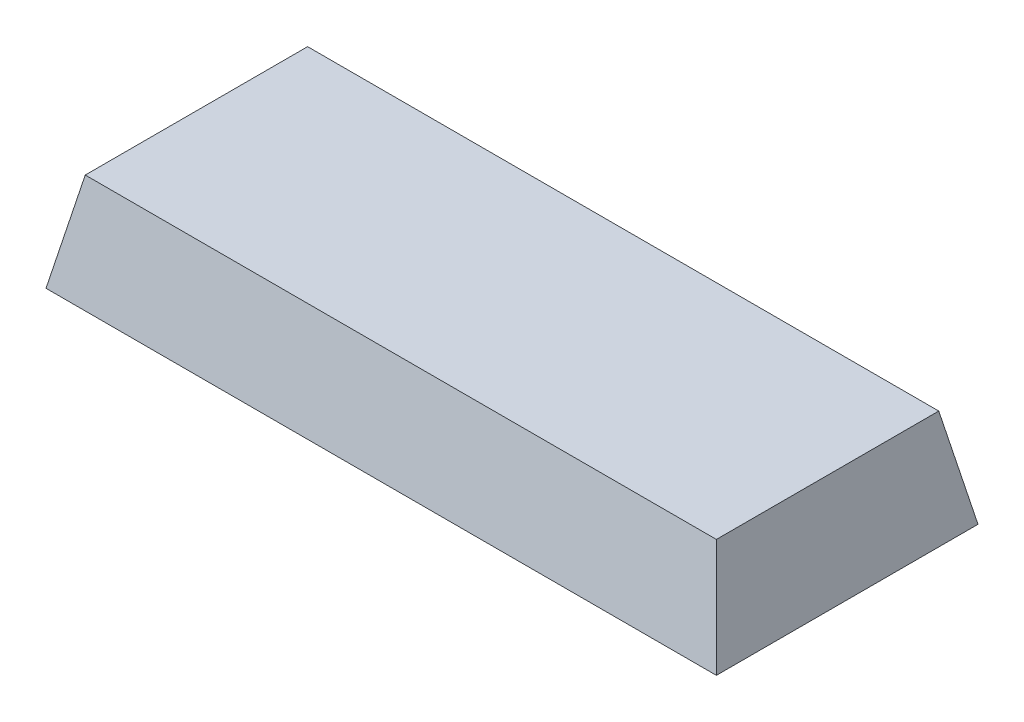
ISO-10303-21;
HEADER;
FILE_DESCRIPTION(('STEP AP214'),'2;1');
FILE_NAME('part.step','',(''),(''),'','','');
FILE_SCHEMA(('AUTOMOTIVE_DESIGN { 1 0 10303 214 1 1 1 1 }'));
ENDSEC;
DATA;
#1=APPLICATION_CONTEXT('core data for automotive mechanical design processes');
#2=APPLICATION_PROTOCOL_DEFINITION('international standard','automotive_design',2000,#1);
#3=PRODUCT_CONTEXT('',#1,'mechanical');
#4=PRODUCT('Part','Part','',(#3));
#5=PRODUCT_RELATED_PRODUCT_CATEGORY('part','',(#4));
#6=PRODUCT_DEFINITION_FORMATION('','',#4);
#7=PRODUCT_DEFINITION_CONTEXT('part definition',#1,'design');
#8=PRODUCT_DEFINITION('design','',#6,#7);
#9=PRODUCT_DEFINITION_SHAPE('','',#8);
#10=(LENGTH_UNIT() NAMED_UNIT(*) SI_UNIT(.MILLI.,.METRE.));
#11=(NAMED_UNIT(*) PLANE_ANGLE_UNIT() SI_UNIT($,.RADIAN.));
#12=(NAMED_UNIT(*) SI_UNIT($,.STERADIAN.) SOLID_ANGLE_UNIT());
#13=UNCERTAINTY_MEASURE_WITH_UNIT(LENGTH_MEASURE(1.E-05),#10,'distance_accuracy_value','');
#14=(GEOMETRIC_REPRESENTATION_CONTEXT(3) GLOBAL_UNCERTAINTY_ASSIGNED_CONTEXT((#13)) GLOBAL_UNIT_ASSIGNED_CONTEXT((#10,
#11,#12)) REPRESENTATION_CONTEXT('',''));
#15=CARTESIAN_POINT('',(0.,0.,0.));
#16=DIRECTION('',(0.,0.,1.));
#17=DIRECTION('',(1.,0.,0.));
#18=AXIS2_PLACEMENT_3D('',#15,#16,#17);
#19=CARTESIAN_POINT('',(0.,3.,0.));
#20=DIRECTION('',(0.,-1.,0.));
#21=DIRECTION('',(0.,0.,-1.));
#22=AXIS2_PLACEMENT_3D('',#19,#20,#21);
#23=PLANE('',#22);
#24=DIRECTION('',(-1.,0.,0.));
#25=VECTOR('',#24,1.);
#26=CARTESIAN_POINT('',(20.500055,3.,-0.6));
#27=LINE('',#26,#25);
#28=CARTESIAN_POINT('',(19.9,3.,-0.6));
#29=VERTEX_POINT('',#28);
#30=CARTESIAN_POINT('',(0.6,3.,-0.6));
#31=VERTEX_POINT('',#30);
#32=EDGE_CURVE('E145',#29,#31,#27,.T.);
#33=ORIENTED_EDGE('',*,*,#32,.F.);
#34=DIRECTION('',(0.,0.,1.));
#35=VECTOR('',#34,1.);
#36=CARTESIAN_POINT('',(19.9,3.,-8.));
#37=LINE('',#36,#35);
#38=CARTESIAN_POINT('',(19.9,3.,-7.4));
#39=VERTEX_POINT('',#38);
#40=EDGE_CURVE('E155',#39,#29,#37,.T.);
#41=ORIENTED_EDGE('',*,*,#40,.F.);
#42=DIRECTION('',(-1.,0.,0.));
#43=VECTOR('',#42,1.);
#44=CARTESIAN_POINT('',(20.500055,3.,-7.4));
#45=LINE('',#44,#43);
#46=CARTESIAN_POINT('',(0.599999999999998,3.,-7.4));
#47=VERTEX_POINT('',#46);
#48=EDGE_CURVE('E140',#39,#47,#45,.T.);
#49=ORIENTED_EDGE('',*,*,#48,.T.);
#50=DIRECTION('',(0.,0.,1.));
#51=VECTOR('',#50,1.);
#52=CARTESIAN_POINT('',(0.6,3.,-8.));
#53=LINE('',#52,#51);
#54=EDGE_CURVE('E161',#47,#31,#53,.T.);
#55=ORIENTED_EDGE('',*,*,#54,.T.);
#56=EDGE_LOOP('',(#33,#41,#49,#55));
#57=FACE_BOUND('',#56,.T.);
#58=ADVANCED_FACE('F43',(#57),#23,.F.);
#59=CARTESIAN_POINT('',(20.5,0.,-8.));
#60=DIRECTION('',(-0.98058067569092,-0.196116135138184,0.));
#61=DIRECTION('',(0.196116135138184,-0.98058067569092,0.));
#62=AXIS2_PLACEMENT_3D('',#59,#60,#61);
#63=PLANE('',#62);
#64=DIRECTION('',(-0.192450089729875,0.962250448649376,-0.192450089729875));
#65=VECTOR('',#64,1.);
#66=CARTESIAN_POINT('',(20.2037037037037,1.48148148148148,-0.296296296296295));
#67=LINE('',#66,#65);
#68=CARTESIAN_POINT('',(20.5000245,0.,0.));
#69=VERTEX_POINT('',#68);
#70=EDGE_CURVE('E152',#69,#29,#67,.T.);
#71=ORIENTED_EDGE('',*,*,#70,.F.);
#72=DIRECTION('',(0.,0.,-1.));
#73=VECTOR('',#72,1.);
#74=CARTESIAN_POINT('',(20.5,0.,0.));
#75=LINE('',#74,#73);
#76=CARTESIAN_POINT('',(20.5000025,0.,-8.));
#77=VERTEX_POINT('',#76);
#78=EDGE_CURVE('E180',#69,#77,#75,.T.);
#79=ORIENTED_EDGE('',*,*,#78,.T.);
#80=DIRECTION('',(0.192450089729875,-0.962250448649376,-0.192450089729875));
#81=VECTOR('',#80,1.);
#82=CARTESIAN_POINT('',(20.5,0.,-8.));
#83=LINE('',#82,#81);
#84=EDGE_CURVE('E148',#39,#77,#83,.T.);
#85=ORIENTED_EDGE('',*,*,#84,.F.);
#86=ORIENTED_EDGE('',*,*,#40,.T.);
#87=EDGE_LOOP('',(#71,#79,#85,#86));
#88=FACE_BOUND('',#87,.T.);
#89=ADVANCED_FACE('F220',(#88),#63,.F.);
#90=CARTESIAN_POINT('',(0.,0.,-8.));
#91=DIRECTION('',(0.98058067569092,-0.196116135138184,0.));
#92=DIRECTION('',(0.196116135138184,0.98058067569092,0.));
#93=AXIS2_PLACEMENT_3D('',#90,#91,#92);
#94=PLANE('',#93);
#95=DIRECTION('',(-0.192450089729875,-0.962250448649376,0.192450089729875));
#96=VECTOR('',#95,1.);
#97=CARTESIAN_POINT('',(0.296296296296296,1.48148148148148,-0.296296296296295));
#98=LINE('',#97,#96);
#99=CARTESIAN_POINT('',(-2.5E-06,0.,0.));
#100=VERTEX_POINT('',#99);
#101=EDGE_CURVE('E186',#31,#100,#98,.T.);
#102=ORIENTED_EDGE('',*,*,#101,.F.);
#103=ORIENTED_EDGE('',*,*,#54,.F.);
#104=DIRECTION('',(0.192450089729875,0.962250448649376,0.192450089729875));
#105=VECTOR('',#104,1.);
#106=CARTESIAN_POINT('',(0.,0.,-8.));
#107=LINE('',#106,#105);
#108=CARTESIAN_POINT('',(0.,0.,-8.));
#109=VERTEX_POINT('',#108);
#110=EDGE_CURVE('E171',#109,#47,#107,.T.);
#111=ORIENTED_EDGE('',*,*,#110,.F.);
#112=DIRECTION('',(0.,0.,1.));
#113=VECTOR('',#112,1.);
#114=CARTESIAN_POINT('',(0.,0.,0.));
#115=LINE('',#114,#113);
#116=EDGE_CURVE('E201',#109,#100,#115,.T.);
#117=ORIENTED_EDGE('',*,*,#116,.T.);
#118=EDGE_LOOP('',(#102,#103,#111,#117));
#119=FACE_BOUND('',#118,.T.);
#120=ADVANCED_FACE('F226',(#119),#94,.F.);
#121=CARTESIAN_POINT('',(0.,0.,0.));
#122=DIRECTION('',(0.,-1.,0.));
#123=DIRECTION('',(0.,0.,-1.));
#124=AXIS2_PLACEMENT_3D('',#121,#122,#123);
#125=PLANE('',#124);
#126=DIRECTION('',(0.,0.,-1.));
#127=VECTOR('',#126,1.);
#128=CARTESIAN_POINT('',(6.250011,0.,-8.));
#129=LINE('',#128,#127);
#130=CARTESIAN_POINT('',(6.250011,0.,-6.8));
#131=VERTEX_POINT('',#130);
#132=CARTESIAN_POINT('',(6.250011,0.,-8.));
#133=VERTEX_POINT('',#132);
#134=EDGE_CURVE('E122',#131,#133,#129,.T.);
#135=ORIENTED_EDGE('',*,*,#134,.F.);
#136=DIRECTION('',(-1.,0.,0.));
#137=VECTOR('',#136,1.);
#138=CARTESIAN_POINT('',(6.250011,0.,-6.8));
#139=LINE('',#138,#137);
#140=CARTESIAN_POINT('',(14.250011,0.,-6.8));
#141=VERTEX_POINT('',#140);
#142=EDGE_CURVE('E110',#141,#131,#139,.T.);
#143=ORIENTED_EDGE('',*,*,#142,.F.);
#144=DIRECTION('',(0.,0.,1.));
#145=VECTOR('',#144,1.);
#146=CARTESIAN_POINT('',(14.250011,0.,-8.));
#147=LINE('',#146,#145);
#148=CARTESIAN_POINT('',(14.250011,0.,-8.));
#149=VERTEX_POINT('',#148);
#150=EDGE_CURVE('E118',#149,#141,#147,.T.);
#151=ORIENTED_EDGE('',*,*,#150,.F.);
#152=DIRECTION('',(-1.,0.,0.));
#153=VECTOR('',#152,1.);
#154=CARTESIAN_POINT('',(0.,0.,-8.));
#155=LINE('',#154,#153);
#156=EDGE_CURVE('E168',#77,#149,#155,.T.);
#157=ORIENTED_EDGE('',*,*,#156,.F.);
#158=ORIENTED_EDGE('',*,*,#78,.F.);
#159=DIRECTION('',(1.,0.,0.));
#160=VECTOR('',#159,1.);
#161=CARTESIAN_POINT('',(0.,0.,0.));
#162=LINE('',#161,#160);
#163=EDGE_CURVE('E357',#100,#69,#162,.T.);
#164=ORIENTED_EDGE('',*,*,#163,.F.);
#165=ORIENTED_EDGE('',*,*,#116,.F.);
#166=EDGE_CURVE('E172',#133,#109,#155,.T.);
#167=ORIENTED_EDGE('',*,*,#166,.F.);
#168=EDGE_LOOP('',(#135,#143,#151,#157,#158,#164,#165,#167));
#169=FACE_BOUND('',#168,.T.);
#170=CARTESIAN_POINT('',(10.25000125,0.,-3.75));
#171=DIRECTION('',(0.,-1.,0.));
#172=DIRECTION('',(0.,0.,-1.));
#173=AXIS2_PLACEMENT_3D('',#170,#171,#172);
#174=CIRCLE('',#173,1.75);
#175=CARTESIAN_POINT('',(10.25000125,0.,-5.5));
#176=VERTEX_POINT('',#175);
#177=EDGE_CURVE('E141',#176,#176,#174,.T.);
#178=ORIENTED_EDGE('',*,*,#177,.F.);
#179=EDGE_LOOP('',(#178));
#180=FACE_BOUND('',#179,.T.);
#181=ADVANCED_FACE('F115',(#169,#180),#125,.T.);
#182=CARTESIAN_POINT('',(20.500055,3.,-7.4));
#183=DIRECTION('',(0.,0.196116135138184,-0.98058067569092));
#184=DIRECTION('',(0.,0.98058067569092,0.196116135138184));
#185=AXIS2_PLACEMENT_3D('',#182,#183,#184);
#186=PLANE('',#185);
#187=ORIENTED_EDGE('',*,*,#84,.T.);
#188=ORIENTED_EDGE('',*,*,#156,.T.);
#189=DIRECTION('',(1.,0.,0.));
#190=VECTOR('',#189,1.);
#191=CARTESIAN_POINT('',(6.250011,0.,-8.));
#192=LINE('',#191,#190);
#193=EDGE_CURVE('E129',#133,#149,#192,.T.);
#194=ORIENTED_EDGE('',*,*,#193,.F.);
#195=ORIENTED_EDGE('',*,*,#166,.T.);
#196=ORIENTED_EDGE('',*,*,#110,.T.);
#197=ORIENTED_EDGE('',*,*,#48,.F.);
#198=EDGE_LOOP('',(#187,#188,#194,#195,#196,#197));
#199=FACE_BOUND('',#198,.T.);
#200=ADVANCED_FACE('F204',(#199),#186,.T.);
#201=CARTESIAN_POINT('',(20.500055,0.,0.));
#202=DIRECTION('',(0.,0.196116135138184,0.98058067569092));
#203=DIRECTION('',(0.,-0.98058067569092,0.196116135138184));
#204=AXIS2_PLACEMENT_3D('',#201,#202,#203);
#205=PLANE('',#204);
#206=ORIENTED_EDGE('',*,*,#70,.T.);
#207=ORIENTED_EDGE('',*,*,#32,.T.);
#208=ORIENTED_EDGE('',*,*,#101,.T.);
#209=ORIENTED_EDGE('',*,*,#163,.T.);
#210=EDGE_LOOP('',(#206,#207,#208,#209));
#211=FACE_BOUND('',#210,.T.);
#212=ADVANCED_FACE('F237',(#211),#205,.T.);
#213=CARTESIAN_POINT('',(10.25000125,0.4,-3.75));
#214=DIRECTION('',(0.,-1.,0.));
#215=DIRECTION('',(0.,0.,-1.));
#216=AXIS2_PLACEMENT_3D('',#213,#214,#215);
#217=CYLINDRICAL_SURFACE('',#216,1.75);
#218=CARTESIAN_POINT('',(10.25000125,0.4,-3.75));
#219=DIRECTION('',(0.,-1.,0.));
#220=DIRECTION('',(0.,0.,-1.));
#221=AXIS2_PLACEMENT_3D('',#218,#219,#220);
#222=CIRCLE('',#221,1.75);
#223=CARTESIAN_POINT('',(10.25000125,0.4,-5.5));
#224=VERTEX_POINT('',#223);
#225=EDGE_CURVE('E136',#224,#224,#222,.T.);
#226=ORIENTED_EDGE('',*,*,#225,.F.);
#227=EDGE_LOOP('',(#226));
#228=FACE_BOUND('',#227,.T.);
#229=ORIENTED_EDGE('',*,*,#177,.T.);
#230=EDGE_LOOP('',(#229));
#231=FACE_BOUND('',#230,.T.);
#232=ADVANCED_FACE('F246',(#228,#231),#217,.F.);
#233=CARTESIAN_POINT('',(10.25000125,0.4,-3.75));
#234=DIRECTION('',(0.,-1.,0.));
#235=DIRECTION('',(0.,0.,-1.));
#236=AXIS2_PLACEMENT_3D('',#233,#234,#235);
#237=PLANE('',#236);
#238=ORIENTED_EDGE('',*,*,#225,.T.);
#239=EDGE_LOOP('',(#238));
#240=FACE_BOUND('',#239,.T.);
#241=ADVANCED_FACE('F250',(#240),#237,.T.);
#242=CARTESIAN_POINT('',(6.250011,-2.,-8.));
#243=DIRECTION('',(0.,0.,1.));
#244=DIRECTION('',(1.,0.,0.));
#245=AXIS2_PLACEMENT_3D('',#242,#243,#244);
#246=PLANE('',#245);
#247=ORIENTED_EDGE('',*,*,#193,.T.);
#248=CARTESIAN_POINT('',(10.7859093848622,2.,-8.));
#249=DIRECTION('',(0.,0.,1.));
#250=DIRECTION('',(1.,0.,0.));
#251=AXIS2_PLACEMENT_3D('',#248,#249,#250);
#252=CIRCLE('',#251,4.);
#253=CARTESIAN_POINT('',(10.7859093848622,-2.,-8.));
#254=VERTEX_POINT('',#253);
#255=EDGE_CURVE('E11',#149,#254,#252,.F.);
#256=ORIENTED_EDGE('',*,*,#255,.T.);
#257=DIRECTION('',(1.,0.,0.));
#258=VECTOR('',#257,1.);
#259=CARTESIAN_POINT('',(6.250011,-2.,-8.));
#260=LINE('',#259,#258);
#261=CARTESIAN_POINT('',(9.71411261513775,-2.,-8.));
#262=VERTEX_POINT('',#261);
#263=EDGE_CURVE('E124',#262,#254,#260,.T.);
#264=ORIENTED_EDGE('',*,*,#263,.F.);
#265=CARTESIAN_POINT('',(9.71411261513775,2.,-8.));
#266=DIRECTION('',(0.,0.,1.));
#267=DIRECTION('',(1.,0.,0.));
#268=AXIS2_PLACEMENT_3D('',#265,#266,#267);
#269=CIRCLE('',#268,4.);
#270=EDGE_CURVE('E52',#262,#133,#269,.F.);
#271=ORIENTED_EDGE('',*,*,#270,.T.);
#272=EDGE_LOOP('',(#247,#256,#264,#271));
#273=FACE_BOUND('',#272,.T.);
#274=ADVANCED_FACE('F193',(#273),#246,.F.);
#275=CARTESIAN_POINT('',(6.250011,-2.,-6.8));
#276=DIRECTION('',(0.,0.,-1.));
#277=DIRECTION('',(-1.,0.,0.));
#278=AXIS2_PLACEMENT_3D('',#275,#276,#277);
#279=PLANE('',#278);
#280=DIRECTION('',(-1.,0.,0.));
#281=VECTOR('',#280,1.);
#282=CARTESIAN_POINT('',(6.250011,-2.,-6.8));
#283=LINE('',#282,#281);
#284=CARTESIAN_POINT('',(10.7859093848622,-2.,-6.8));
#285=VERTEX_POINT('',#284);
#286=CARTESIAN_POINT('',(9.71411261513775,-2.,-6.8));
#287=VERTEX_POINT('',#286);
#288=EDGE_CURVE('E111',#285,#287,#283,.T.);
#289=ORIENTED_EDGE('',*,*,#288,.F.);
#290=CARTESIAN_POINT('',(10.7859093848622,2.,-6.8));
#291=DIRECTION('',(0.,0.,-1.));
#292=DIRECTION('',(-1.,0.,0.));
#293=AXIS2_PLACEMENT_3D('',#290,#291,#292);
#294=CIRCLE('',#293,4.);
#295=EDGE_CURVE('E67',#285,#141,#294,.F.);
#296=ORIENTED_EDGE('',*,*,#295,.T.);
#297=ORIENTED_EDGE('',*,*,#142,.T.);
#298=CARTESIAN_POINT('',(9.71411261513775,2.,-6.8));
#299=DIRECTION('',(0.,0.,-1.));
#300=DIRECTION('',(-1.,0.,0.));
#301=AXIS2_PLACEMENT_3D('',#298,#299,#300);
#302=CIRCLE('',#301,4.);
#303=EDGE_CURVE('E59',#131,#287,#302,.F.);
#304=ORIENTED_EDGE('',*,*,#303,.T.);
#305=EDGE_LOOP('',(#289,#296,#297,#304));
#306=FACE_BOUND('',#305,.T.);
#307=ADVANCED_FACE('F109',(#306),#279,.F.);
#308=CARTESIAN_POINT('',(0.,-2.,0.));
#309=DIRECTION('',(0.,1.,0.));
#310=DIRECTION('',(0.,0.,1.));
#311=AXIS2_PLACEMENT_3D('',#308,#309,#310);
#312=PLANE('',#311);
#313=ORIENTED_EDGE('',*,*,#263,.T.);
#314=DIRECTION('',(0.,0.,1.));
#315=VECTOR('',#314,1.);
#316=CARTESIAN_POINT('',(10.7859093848623,-2.,0.));
#317=LINE('',#316,#315);
#318=EDGE_CURVE('E185',#254,#285,#317,.T.);
#319=ORIENTED_EDGE('',*,*,#318,.T.);
#320=ORIENTED_EDGE('',*,*,#288,.T.);
#321=DIRECTION('',(0.,0.,-1.));
#322=VECTOR('',#321,1.);
#323=CARTESIAN_POINT('',(9.71411261513775,-2.,0.));
#324=LINE('',#323,#322);
#325=EDGE_CURVE('E181',#287,#262,#324,.T.);
#326=ORIENTED_EDGE('',*,*,#325,.T.);
#327=EDGE_LOOP('',(#313,#319,#320,#326));
#328=FACE_BOUND('',#327,.T.);
#329=ADVANCED_FACE('F211',(#328),#312,.F.);
#330=CARTESIAN_POINT('',(10.7859093848622,2.,-7.99999999999999));
#331=DIRECTION('',(0.,0.,1.));
#332=DIRECTION('',(1.,0.,0.));
#333=AXIS2_PLACEMENT_3D('',#330,#331,#332);
#334=CYLINDRICAL_SURFACE('',#333,4.);
#335=ORIENTED_EDGE('',*,*,#255,.F.);
#336=ORIENTED_EDGE('',*,*,#150,.T.);
#337=ORIENTED_EDGE('',*,*,#295,.F.);
#338=ORIENTED_EDGE('',*,*,#318,.F.);
#339=EDGE_LOOP('',(#335,#336,#337,#338));
#340=FACE_BOUND('',#339,.T.);
#341=ADVANCED_FACE('F127',(#340),#334,.T.);
#342=CARTESIAN_POINT('',(9.71411261513775,2.,-8.));
#343=DIRECTION('',(0.,0.,-1.));
#344=DIRECTION('',(-1.,0.,0.));
#345=AXIS2_PLACEMENT_3D('',#342,#343,#344);
#346=CYLINDRICAL_SURFACE('',#345,4.);
#347=ORIENTED_EDGE('',*,*,#303,.F.);
#348=ORIENTED_EDGE('',*,*,#134,.T.);
#349=ORIENTED_EDGE('',*,*,#270,.F.);
#350=ORIENTED_EDGE('',*,*,#325,.F.);
#351=EDGE_LOOP('',(#347,#348,#349,#350));
#352=FACE_BOUND('',#351,.T.);
#353=ADVANCED_FACE('F45',(#352),#346,.T.);
#354=CLOSED_SHELL('',(#58,#89,#120,#181,#200,#212,#232,#241,#274,#307,#329,#341,#353));
#355=MANIFOLD_SOLID_BREP('B2',#354);
#356=ADVANCED_BREP_SHAPE_REPRESENTATION('',(#18,#355),#14);
#357=SHAPE_DEFINITION_REPRESENTATION(#9,#356);
ENDSEC;
END-ISO-10303-21;
